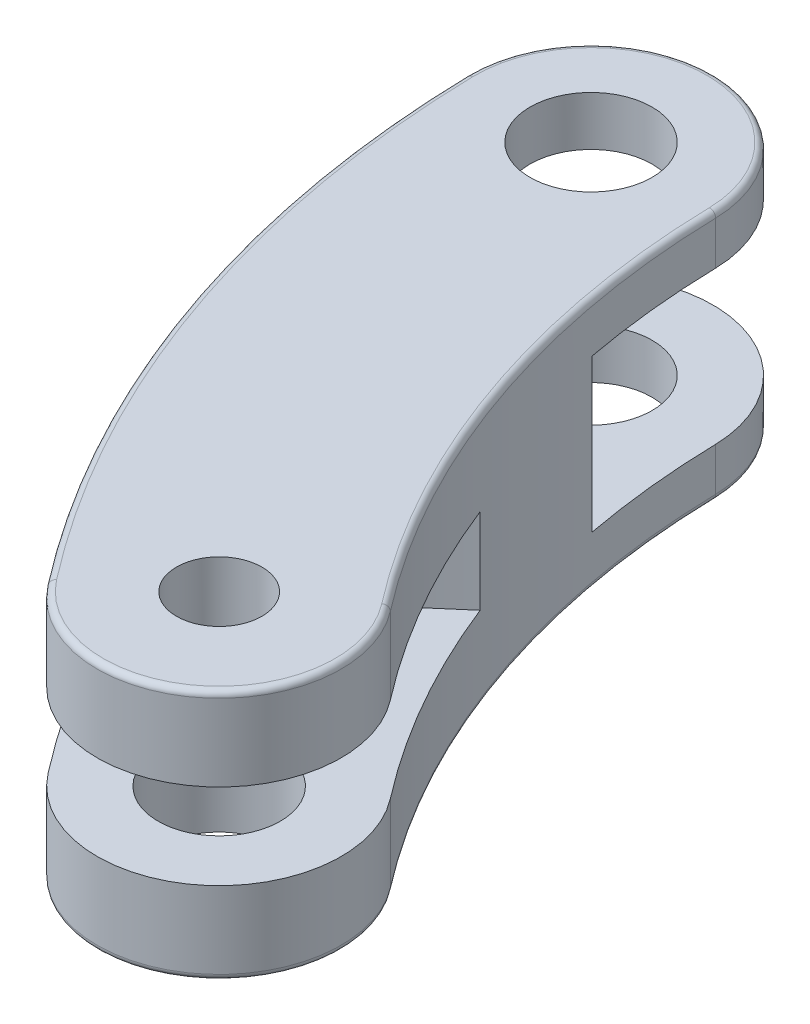
ISO-10303-21;
HEADER;
FILE_DESCRIPTION(('STEP AP214'),'2;1');
FILE_NAME('part.step','',(''),(''),'','','');
FILE_SCHEMA(('AUTOMOTIVE_DESIGN { 1 0 10303 214 1 1 1 1 }'));
ENDSEC;
DATA;
#1=APPLICATION_CONTEXT('core data for automotive mechanical design processes');
#2=APPLICATION_PROTOCOL_DEFINITION('international standard','automotive_design',2000,#1);
#3=PRODUCT_CONTEXT('',#1,'mechanical');
#4=PRODUCT('Part','Part','',(#3));
#5=PRODUCT_RELATED_PRODUCT_CATEGORY('part','',(#4));
#6=PRODUCT_DEFINITION_FORMATION('','',#4);
#7=PRODUCT_DEFINITION_CONTEXT('part definition',#1,'design');
#8=PRODUCT_DEFINITION('design','',#6,#7);
#9=PRODUCT_DEFINITION_SHAPE('','',#8);
#10=(LENGTH_UNIT() NAMED_UNIT(*) SI_UNIT(.MILLI.,.METRE.));
#11=(NAMED_UNIT(*) PLANE_ANGLE_UNIT() SI_UNIT($,.RADIAN.));
#12=(NAMED_UNIT(*) SI_UNIT($,.STERADIAN.) SOLID_ANGLE_UNIT());
#13=UNCERTAINTY_MEASURE_WITH_UNIT(LENGTH_MEASURE(1.E-05),#10,'distance_accuracy_value','');
#14=(GEOMETRIC_REPRESENTATION_CONTEXT(3) GLOBAL_UNCERTAINTY_ASSIGNED_CONTEXT((#13)) GLOBAL_UNIT_ASSIGNED_CONTEXT((#10,
#11,#12)) REPRESENTATION_CONTEXT('',''));
#15=CARTESIAN_POINT('',(0.,0.,0.));
#16=DIRECTION('',(0.,0.,1.));
#17=DIRECTION('',(1.,0.,0.));
#18=AXIS2_PLACEMENT_3D('',#15,#16,#17);
#19=CARTESIAN_POINT('',(2160.44964708,591.734442777,716.131939032001));
#20=DIRECTION('',(0.,1.,0.));
#21=DIRECTION('',(0.,0.,1.));
#22=AXIS2_PLACEMENT_3D('',#19,#20,#21);
#23=CYLINDRICAL_SURFACE('',#22,10.0000000013895);
#24=DIRECTION('',(0.,1.,0.));
#25=VECTOR('',#24,1.);
#26=CARTESIAN_POINT('',(2168.36413867013,591.734442777,710.019589001315));
#27=LINE('',#26,#25);
#28=CARTESIAN_POINT('',(2168.36413867013,605.534442777001,710.019589001315));
#29=VERTEX_POINT('',#28);
#30=CARTESIAN_POINT('',(2168.36413867013,611.833591467126,710.019589001315));
#31=VERTEX_POINT('',#30);
#32=EDGE_CURVE('E196',#29,#31,#27,.T.);
#33=ORIENTED_EDGE('',*,*,#32,.T.);
#34=CARTESIAN_POINT('',(2160.44964708,611.833591467126,716.131939032001));
#35=DIRECTION('',(0.,-1.,0.));
#36=DIRECTION('',(0.,0.,-1.));
#37=AXIS2_PLACEMENT_3D('',#34,#35,#36);
#38=CIRCLE('',#37,10.0000000013895);
#39=CARTESIAN_POINT('',(2152.535155487,611.833591467126,722.244289064911));
#40=VERTEX_POINT('',#39);
#41=EDGE_CURVE('E232',#31,#40,#38,.T.);
#42=ORIENTED_EDGE('',*,*,#41,.T.);
#43=DIRECTION('',(0.,1.,0.));
#44=VECTOR('',#43,1.);
#45=CARTESIAN_POINT('',(2152.535155487,591.734442777,722.244289064911));
#46=LINE('',#45,#44);
#47=CARTESIAN_POINT('',(2152.535155487,605.534442777001,722.244289064911));
#48=VERTEX_POINT('',#47);
#49=EDGE_CURVE('E199',#48,#40,#46,.T.);
#50=ORIENTED_EDGE('',*,*,#49,.F.);
#51=CARTESIAN_POINT('',(2160.44964708,605.534442777001,716.131939032001));
#52=DIRECTION('',(0.,1.,0.));
#53=DIRECTION('',(0.,0.,1.));
#54=AXIS2_PLACEMENT_3D('',#51,#52,#53);
#55=CIRCLE('',#54,10.0000000013895);
#56=EDGE_CURVE('E155',#29,#48,#55,.F.);
#57=ORIENTED_EDGE('',*,*,#56,.F.);
#58=EDGE_LOOP('',(#33,#42,#50,#57));
#59=FACE_BOUND('',#58,.T.);
#60=ADVANCED_FACE('F33',(#59),#23,.T.);
#61=CARTESIAN_POINT('',(2143.78489095,591.734442777,668.990811517002));
#62=DIRECTION('',(0.,1.,0.));
#63=DIRECTION('',(0.,0.,1.));
#64=AXIS2_PLACEMENT_3D('',#61,#62,#63);
#65=CYLINDRICAL_SURFACE('',#64,10.0000000022474);
#66=DIRECTION('',(0.,1.,0.));
#67=VECTOR('',#66,1.);
#68=CARTESIAN_POINT('',(2133.78730484331,591.734442777,669.210520607289));
#69=LINE('',#68,#67);
#70=CARTESIAN_POINT('',(2133.78730484331,608.284442777,669.210520607289));
#71=VERTEX_POINT('',#70);
#72=CARTESIAN_POINT('',(2133.78730484331,611.833591467126,669.210520607289));
#73=VERTEX_POINT('',#72);
#74=EDGE_CURVE('E202',#71,#73,#69,.T.);
#75=ORIENTED_EDGE('',*,*,#74,.T.);
#76=CARTESIAN_POINT('',(2143.78489095,611.833591467126,668.990811517002));
#77=DIRECTION('',(0.,-1.,0.));
#78=DIRECTION('',(0.,0.,-1.));
#79=AXIS2_PLACEMENT_3D('',#76,#77,#78);
#80=CIRCLE('',#79,10.0000000022474);
#81=CARTESIAN_POINT('',(2153.78247705669,611.833591467126,668.771102426715));
#82=VERTEX_POINT('',#81);
#83=EDGE_CURVE('E225',#73,#82,#80,.T.);
#84=ORIENTED_EDGE('',*,*,#83,.T.);
#85=DIRECTION('',(0.,1.,0.));
#86=VECTOR('',#85,1.);
#87=CARTESIAN_POINT('',(2153.78247705669,591.734442777,668.771102426715));
#88=LINE('',#87,#86);
#89=CARTESIAN_POINT('',(2153.78247705669,608.284442777,668.771102426715));
#90=VERTEX_POINT('',#89);
#91=EDGE_CURVE('E192',#90,#82,#88,.T.);
#92=ORIENTED_EDGE('',*,*,#91,.F.);
#93=CARTESIAN_POINT('',(2143.78489095,608.284442777,668.990811517002));
#94=DIRECTION('',(0.,1.,0.));
#95=DIRECTION('',(0.,0.,1.));
#96=AXIS2_PLACEMENT_3D('',#93,#94,#95);
#97=CIRCLE('',#96,10.0000000022474);
#98=EDGE_CURVE('E207',#71,#90,#97,.F.);
#99=ORIENTED_EDGE('',*,*,#98,.F.);
#100=EDGE_LOOP('',(#75,#84,#92,#99));
#101=FACE_BOUND('',#100,.T.);
#102=ADVANCED_FACE('F346',(#101),#65,.T.);
#103=CARTESIAN_POINT('',(2223.76557979,591.734442777,667.233138795002));
#104=DIRECTION('',(0.,1.,0.));
#105=DIRECTION('',(0.,0.,1.));
#106=AXIS2_PLACEMENT_3D('',#103,#104,#105);
#107=CYLINDRICAL_SURFACE('',#106,69.9999999986104);
#108=CARTESIAN_POINT('',(2168.36413867013,592.235398447253,710.019589001315));
#109=VERTEX_POINT('',#108);
#110=CARTESIAN_POINT('',(2168.36413867013,598.534442777,710.019589001315));
#111=VERTEX_POINT('',#110);
#112=EDGE_CURVE('E193',#109,#111,#27,.T.);
#113=ORIENTED_EDGE('',*,*,#112,.F.);
#114=CARTESIAN_POINT('',(2223.76557979,592.235398447253,667.233138795002));
#115=DIRECTION('',(0.,-1.,0.));
#116=DIRECTION('',(0.,0.,-1.));
#117=AXIS2_PLACEMENT_3D('',#114,#115,#116);
#118=CIRCLE('',#117,69.9999999986104);
#119=CARTESIAN_POINT('',(2153.78247705669,592.235398447253,668.771102426715));
#120=VERTEX_POINT('',#119);
#121=EDGE_CURVE('E234',#109,#120,#118,.T.);
#122=ORIENTED_EDGE('',*,*,#121,.T.);
#123=CARTESIAN_POINT('',(2153.78247705669,595.784442777,668.771102426715));
#124=VERTEX_POINT('',#123);
#125=EDGE_CURVE('E203',#120,#124,#88,.T.);
#126=ORIENTED_EDGE('',*,*,#125,.T.);
#127=CARTESIAN_POINT('',(2223.76557979,595.784442777,667.233138795002));
#128=DIRECTION('',(0.,-1.,0.));
#129=DIRECTION('',(0.,0.,-1.));
#130=AXIS2_PLACEMENT_3D('',#127,#128,#129);
#131=CIRCLE('',#130,69.9999999986104);
#132=CARTESIAN_POINT('',(2154.95172259144,595.784442777,680.064859539381));
#133=VERTEX_POINT('',#132);
#134=EDGE_CURVE('E183',#133,#124,#131,.T.);
#135=ORIENTED_EDGE('',*,*,#134,.F.);
#136=DIRECTION('',(0.,1.,0.));
#137=VECTOR('',#136,1.);
#138=CARTESIAN_POINT('',(2154.95172259144,602.034442777,680.064859539381));
#139=LINE('',#138,#137);
#140=CARTESIAN_POINT('',(2154.95172259144,608.284442777,680.064859539381));
#141=VERTEX_POINT('',#140);
#142=EDGE_CURVE('E190',#141,#133,#139,.F.);
#143=ORIENTED_EDGE('',*,*,#142,.F.);
#144=CARTESIAN_POINT('',(2223.76557979,608.284442777,667.233138795002));
#145=DIRECTION('',(0.,1.,0.));
#146=DIRECTION('',(0.,0.,1.));
#147=AXIS2_PLACEMENT_3D('',#144,#145,#146);
#148=CIRCLE('',#147,69.9999999986104);
#149=EDGE_CURVE('E188',#90,#141,#148,.T.);
#150=ORIENTED_EDGE('',*,*,#149,.F.);
#151=ORIENTED_EDGE('',*,*,#91,.T.);
#152=CARTESIAN_POINT('',(2223.76557979,611.833591467126,667.233138795002));
#153=DIRECTION('',(0.,-1.,0.));
#154=DIRECTION('',(0.,0.,-1.));
#155=AXIS2_PLACEMENT_3D('',#152,#153,#154);
#156=CIRCLE('',#155,69.9999999986104);
#157=EDGE_CURVE('E230',#82,#31,#156,.F.);
#158=ORIENTED_EDGE('',*,*,#157,.T.);
#159=ORIENTED_EDGE('',*,*,#32,.F.);
#160=CARTESIAN_POINT('',(2223.76557979,605.534442777001,667.233138795002));
#161=DIRECTION('',(0.,1.,0.));
#162=DIRECTION('',(0.,0.,1.));
#163=AXIS2_PLACEMENT_3D('',#160,#161,#162);
#164=CIRCLE('',#163,69.9999999986104);
#165=CARTESIAN_POINT('',(2158.66503431145,605.534442777001,692.960924906513));
#166=VERTEX_POINT('',#165);
#167=EDGE_CURVE('E170',#166,#29,#164,.T.);
#168=ORIENTED_EDGE('',*,*,#167,.F.);
#169=DIRECTION('',(0.,1.,0.));
#170=VECTOR('',#169,1.);
#171=CARTESIAN_POINT('',(2158.66503431145,602.034442777001,692.960924906513));
#172=LINE('',#171,#170);
#173=CARTESIAN_POINT('',(2158.66503431145,598.534442777,692.960924906513));
#174=VERTEX_POINT('',#173);
#175=EDGE_CURVE('E160',#174,#166,#172,.T.);
#176=ORIENTED_EDGE('',*,*,#175,.F.);
#177=CARTESIAN_POINT('',(2223.76557979,598.534442777,667.233138795002));
#178=DIRECTION('',(0.,-1.,0.));
#179=DIRECTION('',(0.,0.,-1.));
#180=AXIS2_PLACEMENT_3D('',#177,#178,#179);
#181=CIRCLE('',#180,69.9999999986104);
#182=EDGE_CURVE('E144',#111,#174,#181,.T.);
#183=ORIENTED_EDGE('',*,*,#182,.F.);
#184=EDGE_LOOP('',(#113,#122,#126,#135,#143,#150,#151,#158,#159,#168,#176,#183));
#185=FACE_BOUND('',#184,.T.);
#186=ADVANCED_FACE('F35',(#185),#107,.F.);
#187=CARTESIAN_POINT('',(2152.535155487,592.235398447253,722.244289064911));
#188=VERTEX_POINT('',#187);
#189=CARTESIAN_POINT('',(2152.535155487,598.534442777,722.244289064911));
#190=VERTEX_POINT('',#189);
#191=EDGE_CURVE('E197',#188,#190,#46,.T.);
#192=ORIENTED_EDGE('',*,*,#191,.F.);
#193=CARTESIAN_POINT('',(2160.44964708,592.235398447253,716.131939032001));
#194=DIRECTION('',(0.,-1.,0.));
#195=DIRECTION('',(0.,0.,-1.));
#196=AXIS2_PLACEMENT_3D('',#193,#194,#195);
#197=CIRCLE('',#196,10.0000000013895);
#198=EDGE_CURVE('E246',#188,#109,#197,.F.);
#199=ORIENTED_EDGE('',*,*,#198,.T.);
#200=ORIENTED_EDGE('',*,*,#112,.T.);
#201=CARTESIAN_POINT('',(2160.44964708,598.534442777,716.131939032001));
#202=DIRECTION('',(0.,-1.,0.));
#203=DIRECTION('',(0.,0.,-1.));
#204=AXIS2_PLACEMENT_3D('',#201,#202,#203);
#205=CIRCLE('',#204,10.0000000013895);
#206=EDGE_CURVE('E151',#190,#111,#205,.F.);
#207=ORIENTED_EDGE('',*,*,#206,.F.);
#208=EDGE_LOOP('',(#192,#199,#200,#207));
#209=FACE_BOUND('',#208,.T.);
#210=ADVANCED_FACE('F249',(#209),#23,.T.);
#211=CARTESIAN_POINT('',(2223.76557979,591.734442777,667.233138795002));
#212=DIRECTION('',(0.,1.,0.));
#213=DIRECTION('',(0.,0.,1.));
#214=AXIS2_PLACEMENT_3D('',#211,#212,#213);
#215=CYLINDRICAL_SURFACE('',#214,90.0000000022474);
#216=CARTESIAN_POINT('',(2133.78730484331,592.235398447253,669.210520607289));
#217=VERTEX_POINT('',#216);
#218=CARTESIAN_POINT('',(2133.78730484331,595.784442777,669.210520607289));
#219=VERTEX_POINT('',#218);
#220=EDGE_CURVE('E200',#217,#219,#69,.T.);
#221=ORIENTED_EDGE('',*,*,#220,.F.);
#222=CARTESIAN_POINT('',(2223.76557979,592.235398447253,667.233138795002));
#223=DIRECTION('',(0.,-1.,0.));
#224=DIRECTION('',(0.,0.,-1.));
#225=AXIS2_PLACEMENT_3D('',#222,#223,#224);
#226=CIRCLE('',#225,90.0000000022474);
#227=EDGE_CURVE('E11',#217,#188,#226,.F.);
#228=ORIENTED_EDGE('',*,*,#227,.T.);
#229=ORIENTED_EDGE('',*,*,#191,.T.);
#230=CARTESIAN_POINT('',(2223.76557979,598.534442777,667.233138795002));
#231=DIRECTION('',(0.,-1.,0.));
#232=DIRECTION('',(0.,0.,-1.));
#233=AXIS2_PLACEMENT_3D('',#230,#231,#232);
#234=CIRCLE('',#233,90.0000000022474);
#235=CARTESIAN_POINT('',(2143.99607730454,598.534442777,708.90838892773));
#236=VERTEX_POINT('',#235);
#237=EDGE_CURVE('E211',#236,#190,#234,.F.);
#238=ORIENTED_EDGE('',*,*,#237,.F.);
#239=DIRECTION('',(0.,1.,0.));
#240=VECTOR('',#239,1.);
#241=CARTESIAN_POINT('',(2143.99607730454,602.034442777001,708.90838892773));
#242=LINE('',#241,#240);
#243=CARTESIAN_POINT('',(2143.99607730454,605.534442777001,708.908388927731));
#244=VERTEX_POINT('',#243);
#245=EDGE_CURVE('E163',#244,#236,#242,.F.);
#246=ORIENTED_EDGE('',*,*,#245,.F.);
#247=CARTESIAN_POINT('',(2223.76557979,605.534442777001,667.233138795002));
#248=DIRECTION('',(0.,1.,0.));
#249=DIRECTION('',(0.,0.,1.));
#250=AXIS2_PLACEMENT_3D('',#247,#248,#249);
#251=CIRCLE('',#250,90.0000000022474);
#252=EDGE_CURVE('E214',#48,#244,#251,.F.);
#253=ORIENTED_EDGE('',*,*,#252,.F.);
#254=ORIENTED_EDGE('',*,*,#49,.T.);
#255=CARTESIAN_POINT('',(2223.76557979,611.833591467126,667.233138795002));
#256=DIRECTION('',(0.,-1.,0.));
#257=DIRECTION('',(0.,0.,-1.));
#258=AXIS2_PLACEMENT_3D('',#255,#256,#257);
#259=CIRCLE('',#258,90.0000000022474);
#260=EDGE_CURVE('E228',#40,#73,#259,.T.);
#261=ORIENTED_EDGE('',*,*,#260,.T.);
#262=ORIENTED_EDGE('',*,*,#74,.F.);
#263=CARTESIAN_POINT('',(2223.76557979,608.284442777,667.233138795002));
#264=DIRECTION('',(0.,1.,0.));
#265=DIRECTION('',(0.,0.,1.));
#266=AXIS2_PLACEMENT_3D('',#263,#264,#265);
#267=CIRCLE('',#266,90.0000000022474);
#268=CARTESIAN_POINT('',(2135.40094688099,608.284442777,684.31212152993));
#269=VERTEX_POINT('',#268);
#270=EDGE_CURVE('E186',#269,#71,#267,.F.);
#271=ORIENTED_EDGE('',*,*,#270,.F.);
#272=DIRECTION('',(0.,1.,0.));
#273=VECTOR('',#272,1.);
#274=CARTESIAN_POINT('',(2135.40094688099,602.034442777,684.31212152993));
#275=LINE('',#274,#273);
#276=CARTESIAN_POINT('',(2135.40094688099,595.784442777,684.31212152993));
#277=VERTEX_POINT('',#276);
#278=EDGE_CURVE('E209',#277,#269,#275,.T.);
#279=ORIENTED_EDGE('',*,*,#278,.F.);
#280=CARTESIAN_POINT('',(2223.76557979,595.784442777,667.233138795002));
#281=DIRECTION('',(0.,-1.,0.));
#282=DIRECTION('',(0.,0.,-1.));
#283=AXIS2_PLACEMENT_3D('',#280,#281,#282);
#284=CIRCLE('',#283,90.0000000022474);
#285=EDGE_CURVE('E181',#219,#277,#284,.F.);
#286=ORIENTED_EDGE('',*,*,#285,.F.);
#287=EDGE_LOOP('',(#221,#228,#229,#238,#246,#253,#254,#261,#262,#271,#279,#286));
#288=FACE_BOUND('',#287,.T.);
#289=ADVANCED_FACE('F319',(#288),#215,.T.);
#290=ORIENTED_EDGE('',*,*,#125,.F.);
#291=CARTESIAN_POINT('',(2143.78489095,592.235398447253,668.990811517002));
#292=DIRECTION('',(0.,-1.,0.));
#293=DIRECTION('',(0.,0.,-1.));
#294=AXIS2_PLACEMENT_3D('',#291,#292,#293);
#295=CIRCLE('',#294,10.0000000022474);
#296=EDGE_CURVE('E41',#120,#217,#295,.F.);
#297=ORIENTED_EDGE('',*,*,#296,.T.);
#298=ORIENTED_EDGE('',*,*,#220,.T.);
#299=CARTESIAN_POINT('',(2143.78489095,595.784442777,668.990811517002));
#300=DIRECTION('',(0.,-1.,0.));
#301=DIRECTION('',(0.,0.,-1.));
#302=AXIS2_PLACEMENT_3D('',#299,#300,#301);
#303=CIRCLE('',#302,10.0000000022474);
#304=EDGE_CURVE('E195',#124,#219,#303,.F.);
#305=ORIENTED_EDGE('',*,*,#304,.F.);
#306=EDGE_LOOP('',(#290,#297,#298,#305));
#307=FACE_BOUND('',#306,.T.);
#308=ADVANCED_FACE('F365',(#307),#65,.T.);
#309=CARTESIAN_POINT('',(2183.77523537,591.734442777,668.111975156002));
#310=DIRECTION('',(0.,-1.,0.));
#311=DIRECTION('',(0.,0.,-1.));
#312=AXIS2_PLACEMENT_3D('',#309,#310,#311);
#313=PLANE('',#312);
#314=CARTESIAN_POINT('',(2143.78489095,591.734442777,668.990811517002));
#315=DIRECTION('',(0.,-1.,0.));
#316=DIRECTION('',(0.,0.,-1.));
#317=AXIS2_PLACEMENT_3D('',#314,#315,#316);
#318=CIRCLE('',#317,9.49904433199418);
#319=CARTESIAN_POINT('',(2134.28813959259,591.734442777,669.199514155734));
#320=VERTEX_POINT('',#319);
#321=CARTESIAN_POINT('',(2153.2816423119,591.734442777,668.782108878171));
#322=VERTEX_POINT('',#321);
#323=EDGE_CURVE('E239',#320,#322,#318,.T.);
#324=ORIENTED_EDGE('',*,*,#323,.T.);
#325=CARTESIAN_POINT('',(2223.76557979,591.734442777,667.233138795002));
#326=DIRECTION('',(0.,-1.,0.));
#327=DIRECTION('',(0.,0.,-1.));
#328=AXIS2_PLACEMENT_3D('',#325,#326,#327);
#329=CIRCLE('',#328,70.5009556688637);
#330=CARTESIAN_POINT('',(2167.96765772626,591.734442777,710.325790641917));
#331=VERTEX_POINT('',#330);
#332=EDGE_CURVE('E243',#322,#331,#329,.F.);
#333=ORIENTED_EDGE('',*,*,#332,.T.);
#334=CARTESIAN_POINT('',(2160.44964708,591.734442777,716.131939032001));
#335=DIRECTION('',(0.,-1.,0.));
#336=DIRECTION('',(0.,0.,-1.));
#337=AXIS2_PLACEMENT_3D('',#334,#335,#336);
#338=CIRCLE('',#337,9.49904433113628);
#339=CARTESIAN_POINT('',(2152.93163643087,591.734442777,721.938087424309));
#340=VERTEX_POINT('',#339);
#341=EDGE_CURVE('E241',#331,#340,#338,.T.);
#342=ORIENTED_EDGE('',*,*,#341,.T.);
#343=CARTESIAN_POINT('',(2223.76557979,591.734442777,667.233138795002));
#344=DIRECTION('',(0.,-1.,0.));
#345=DIRECTION('',(0.,0.,-1.));
#346=AXIS2_PLACEMENT_3D('',#343,#344,#345);
#347=CIRCLE('',#346,89.4990443319942);
#348=EDGE_CURVE('E237',#340,#320,#347,.T.);
#349=ORIENTED_EDGE('',*,*,#348,.T.);
#350=EDGE_LOOP('',(#324,#333,#342,#349));
#351=FACE_BOUND('',#350,.T.);
#352=CARTESIAN_POINT('',(2143.78489095,591.734442777,668.990811517002));
#353=DIRECTION('',(0.,-1.,0.));
#354=DIRECTION('',(0.,0.,1.));
#355=AXIS2_PLACEMENT_3D('',#352,#353,#354);
#356=CIRCLE('',#355,5.);
#357=CARTESIAN_POINT('',(2143.78489095,591.734442777,673.990811517002));
#358=VERTEX_POINT('',#357);
#359=EDGE_CURVE('E287',#358,#358,#356,.T.);
#360=ORIENTED_EDGE('',*,*,#359,.F.);
#361=EDGE_LOOP('',(#360));
#362=FACE_BOUND('',#361,.T.);
#363=CARTESIAN_POINT('',(2160.44964708,591.734442777,716.131939032002));
#364=DIRECTION('',(0.,-1.,0.));
#365=DIRECTION('',(0.,0.,1.));
#366=AXIS2_PLACEMENT_3D('',#363,#364,#365);
#367=CIRCLE('',#366,5.);
#368=CARTESIAN_POINT('',(2160.44964708,591.734442777,721.131939032002));
#369=VERTEX_POINT('',#368);
#370=EDGE_CURVE('E293',#369,#369,#367,.T.);
#371=ORIENTED_EDGE('',*,*,#370,.F.);
#372=EDGE_LOOP('',(#371));
#373=FACE_BOUND('',#372,.T.);
#374=ADVANCED_FACE('F540',(#351,#362,#373),#313,.T.);
#375=CARTESIAN_POINT('',(2183.77523537,612.334442777,668.111975156002));
#376=DIRECTION('',(0.,-1.,0.));
#377=DIRECTION('',(0.,0.,-1.));
#378=AXIS2_PLACEMENT_3D('',#375,#376,#377);
#379=PLANE('',#378);
#380=CARTESIAN_POINT('',(2223.76557979,612.334442777,667.233138795002));
#381=DIRECTION('',(0.,-1.,0.));
#382=DIRECTION('',(0.,0.,-1.));
#383=AXIS2_PLACEMENT_3D('',#380,#381,#382);
#384=CIRCLE('',#383,70.5008513084845);
#385=CARTESIAN_POINT('',(2167.96774032219,612.334442777,710.3257268532));
#386=VERTEX_POINT('',#385);
#387=CARTESIAN_POINT('',(2153.28174665072,612.334442777,668.782106585199));
#388=VERTEX_POINT('',#387);
#389=EDGE_CURVE('E218',#386,#388,#384,.T.);
#390=ORIENTED_EDGE('',*,*,#389,.T.);
#391=CARTESIAN_POINT('',(2143.78489095,612.334442777,668.990811517002));
#392=DIRECTION('',(0.,-1.,0.));
#393=DIRECTION('',(0.,0.,-1.));
#394=AXIS2_PLACEMENT_3D('',#391,#392,#393);
#395=CIRCLE('',#394,9.49914869237342);
#396=CARTESIAN_POINT('',(2134.28803525741,612.334442777,669.199516448627));
#397=VERTEX_POINT('',#396);
#398=EDGE_CURVE('E222',#388,#397,#395,.F.);
#399=ORIENTED_EDGE('',*,*,#398,.T.);
#400=CARTESIAN_POINT('',(2223.76557979,612.334442777,667.233138795002));
#401=DIRECTION('',(0.,-1.,0.));
#402=DIRECTION('',(0.,0.,-1.));
#403=AXIS2_PLACEMENT_3D('',#400,#401,#402);
#404=CIRCLE('',#403,89.4991486923734);
#405=CARTESIAN_POINT('',(2152.93155383781,612.334442777,721.938151210803));
#406=VERTEX_POINT('',#405);
#407=EDGE_CURVE('E220',#397,#406,#404,.F.);
#408=ORIENTED_EDGE('',*,*,#407,.T.);
#409=CARTESIAN_POINT('',(2160.44964708,612.334442777,716.131939032001));
#410=DIRECTION('',(0.,-1.,0.));
#411=DIRECTION('',(0.,0.,-1.));
#412=AXIS2_PLACEMENT_3D('',#409,#410,#411);
#413=CIRCLE('',#412,9.49914869151552);
#414=EDGE_CURVE('E216',#406,#386,#413,.F.);
#415=ORIENTED_EDGE('',*,*,#414,.T.);
#416=EDGE_LOOP('',(#390,#399,#408,#415));
#417=FACE_BOUND('',#416,.T.);
#418=CARTESIAN_POINT('',(2143.78489095,612.334442777,668.990811517002));
#419=DIRECTION('',(0.,-1.,0.));
#420=DIRECTION('',(0.,0.,-1.));
#421=AXIS2_PLACEMENT_3D('',#418,#419,#420);
#422=CIRCLE('',#421,5.);
#423=CARTESIAN_POINT('',(2143.78489095,612.334442777,663.990811517002));
#424=VERTEX_POINT('',#423);
#425=EDGE_CURVE('E302',#424,#424,#422,.F.);
#426=ORIENTED_EDGE('',*,*,#425,.F.);
#427=EDGE_LOOP('',(#426));
#428=FACE_BOUND('',#427,.T.);
#429=CARTESIAN_POINT('',(2160.44964708,612.334442777,716.131939032));
#430=DIRECTION('',(0.,1.,0.));
#431=DIRECTION('',(0.,0.,-1.));
#432=AXIS2_PLACEMENT_3D('',#429,#430,#431);
#433=CIRCLE('',#432,3.49999999999995);
#434=CARTESIAN_POINT('',(2160.44964708,612.334442777,712.631939032));
#435=VERTEX_POINT('',#434);
#436=EDGE_CURVE('E305',#435,#435,#433,.T.);
#437=ORIENTED_EDGE('',*,*,#436,.F.);
#438=EDGE_LOOP('',(#437));
#439=FACE_BOUND('',#438,.T.);
#440=ADVANCED_FACE('F334',(#417,#428,#439),#379,.F.);
#441=CARTESIAN_POINT('',(2128.32635665,595.784442777,604.625546920002));
#442=DIRECTION('',(0.,1.,0.));
#443=DIRECTION('',(0.,0.,1.));
#444=AXIS2_PLACEMENT_3D('',#441,#442,#443);
#445=CYLINDRICAL_SURFACE('',#444,80.0000000000001);
#446=ORIENTED_EDGE('',*,*,#142,.T.);
#447=CARTESIAN_POINT('',(2128.32635665,595.784442777,604.625546920002));
#448=DIRECTION('',(0.,1.,0.));
#449=DIRECTION('',(0.,0.,1.));
#450=AXIS2_PLACEMENT_3D('',#447,#448,#449);
#451=CIRCLE('',#450,80.);
#452=EDGE_CURVE('E171',#277,#133,#451,.T.);
#453=ORIENTED_EDGE('',*,*,#452,.F.);
#454=ORIENTED_EDGE('',*,*,#278,.T.);
#455=CARTESIAN_POINT('',(2128.32635665,608.284442777,604.625546920002));
#456=DIRECTION('',(0.,1.,0.));
#457=DIRECTION('',(0.,0.,1.));
#458=AXIS2_PLACEMENT_3D('',#455,#456,#457);
#459=CIRCLE('',#458,80.0000000000002);
#460=EDGE_CURVE('E174',#269,#141,#459,.T.);
#461=ORIENTED_EDGE('',*,*,#460,.T.);
#462=EDGE_LOOP('',(#446,#453,#454,#461));
#463=FACE_BOUND('',#462,.T.);
#464=ADVANCED_FACE('F527',(#463),#445,.F.);
#465=CARTESIAN_POINT('',(2128.32635665,608.284442777,604.625546920002));
#466=DIRECTION('',(0.,1.,0.));
#467=DIRECTION('',(0.,0.,1.));
#468=AXIS2_PLACEMENT_3D('',#465,#466,#467);
#469=PLANE('',#468);
#470=CARTESIAN_POINT('',(2143.78489095,608.284442777,668.990811517002));
#471=DIRECTION('',(0.,-1.,0.));
#472=DIRECTION('',(0.,0.,1.));
#473=AXIS2_PLACEMENT_3D('',#470,#471,#472);
#474=CIRCLE('',#473,5.);
#475=CARTESIAN_POINT('',(2143.78489095,608.284442777,673.990811517002));
#476=VERTEX_POINT('',#475);
#477=EDGE_CURVE('E299',#476,#476,#474,.T.);
#478=ORIENTED_EDGE('',*,*,#477,.F.);
#479=EDGE_LOOP('',(#478));
#480=FACE_BOUND('',#479,.T.);
#481=ORIENTED_EDGE('',*,*,#149,.T.);
#482=ORIENTED_EDGE('',*,*,#460,.F.);
#483=ORIENTED_EDGE('',*,*,#270,.T.);
#484=ORIENTED_EDGE('',*,*,#98,.T.);
#485=EDGE_LOOP('',(#481,#482,#483,#484));
#486=FACE_BOUND('',#485,.T.);
#487=ADVANCED_FACE('F520',(#480,#486),#469,.F.);
#488=CARTESIAN_POINT('',(2154.95172259093,595.784442777,680.064859539562));
#489=DIRECTION('',(0.,-1.,0.));
#490=DIRECTION('',(0.,0.,-1.));
#491=AXIS2_PLACEMENT_3D('',#488,#489,#490);
#492=PLANE('',#491);
#493=CARTESIAN_POINT('',(2143.78489095,595.784442777,668.990811517002));
#494=DIRECTION('',(0.,-1.,0.));
#495=DIRECTION('',(0.,0.,-1.));
#496=AXIS2_PLACEMENT_3D('',#493,#494,#495);
#497=CIRCLE('',#496,5.);
#498=CARTESIAN_POINT('',(2143.78489095,595.784442777,663.990811517002));
#499=VERTEX_POINT('',#498);
#500=EDGE_CURVE('E290',#499,#499,#497,.F.);
#501=ORIENTED_EDGE('',*,*,#500,.F.);
#502=EDGE_LOOP('',(#501));
#503=FACE_BOUND('',#502,.T.);
#504=ORIENTED_EDGE('',*,*,#134,.T.);
#505=ORIENTED_EDGE('',*,*,#304,.T.);
#506=ORIENTED_EDGE('',*,*,#285,.T.);
#507=ORIENTED_EDGE('',*,*,#452,.T.);
#508=EDGE_LOOP('',(#504,#505,#506,#507));
#509=FACE_BOUND('',#508,.T.);
#510=ADVANCED_FACE('F391',(#503,#509),#492,.F.);
#511=CARTESIAN_POINT('',(2209.66760327,598.534442777,754.594827587));
#512=DIRECTION('',(0.,1.,0.));
#513=DIRECTION('',(0.,0.,1.));
#514=AXIS2_PLACEMENT_3D('',#511,#512,#513);
#515=CYLINDRICAL_SURFACE('',#514,79.9999999999997);
#516=ORIENTED_EDGE('',*,*,#175,.T.);
#517=CARTESIAN_POINT('',(2209.66760327,605.534442777001,754.594827587));
#518=DIRECTION('',(0.,1.,0.));
#519=DIRECTION('',(0.,0.,1.));
#520=AXIS2_PLACEMENT_3D('',#517,#518,#519);
#521=CIRCLE('',#520,79.9999999999996);
#522=EDGE_CURVE('E165',#166,#244,#521,.T.);
#523=ORIENTED_EDGE('',*,*,#522,.T.);
#524=ORIENTED_EDGE('',*,*,#245,.T.);
#525=CARTESIAN_POINT('',(2209.66760327,598.534442777,754.594827587));
#526=DIRECTION('',(0.,1.,0.));
#527=DIRECTION('',(0.,0.,1.));
#528=AXIS2_PLACEMENT_3D('',#525,#526,#527);
#529=CIRCLE('',#528,79.9999999999998);
#530=EDGE_CURVE('E148',#174,#236,#529,.T.);
#531=ORIENTED_EDGE('',*,*,#530,.F.);
#532=EDGE_LOOP('',(#516,#523,#524,#531));
#533=FACE_BOUND('',#532,.T.);
#534=ADVANCED_FACE('F158',(#533),#515,.F.);
#535=CARTESIAN_POINT('',(2209.66760327,605.534442777001,754.594827587));
#536=DIRECTION('',(0.,1.,0.));
#537=DIRECTION('',(0.,0.,1.));
#538=AXIS2_PLACEMENT_3D('',#535,#536,#537);
#539=PLANE('',#538);
#540=CARTESIAN_POINT('',(2160.44964708,605.534442777001,716.131939032));
#541=DIRECTION('',(0.,1.,0.));
#542=DIRECTION('',(0.,0.,1.));
#543=AXIS2_PLACEMENT_3D('',#540,#541,#542);
#544=CIRCLE('',#543,3.49999999999995);
#545=CARTESIAN_POINT('',(2160.44964708,605.534442777001,719.631939032));
#546=VERTEX_POINT('',#545);
#547=EDGE_CURVE('E166',#546,#546,#544,.F.);
#548=ORIENTED_EDGE('',*,*,#547,.F.);
#549=EDGE_LOOP('',(#548));
#550=FACE_BOUND('',#549,.T.);
#551=ORIENTED_EDGE('',*,*,#167,.T.);
#552=ORIENTED_EDGE('',*,*,#56,.T.);
#553=ORIENTED_EDGE('',*,*,#252,.T.);
#554=ORIENTED_EDGE('',*,*,#522,.F.);
#555=EDGE_LOOP('',(#551,#552,#553,#554));
#556=FACE_BOUND('',#555,.T.);
#557=ADVANCED_FACE('F314',(#550,#556),#539,.F.);
#558=CARTESIAN_POINT('',(2143.99607730598,598.534442777,708.90838892565));
#559=DIRECTION('',(0.,-1.,0.));
#560=DIRECTION('',(0.,0.,-1.));
#561=AXIS2_PLACEMENT_3D('',#558,#559,#560);
#562=PLANE('',#561);
#563=CARTESIAN_POINT('',(2160.44964708,598.534442777,716.131939032002));
#564=DIRECTION('',(0.,-1.,0.));
#565=DIRECTION('',(0.,0.,-1.));
#566=AXIS2_PLACEMENT_3D('',#563,#564,#565);
#567=CIRCLE('',#566,5.);
#568=CARTESIAN_POINT('',(2160.44964708,598.534442777,711.131939032002));
#569=VERTEX_POINT('',#568);
#570=EDGE_CURVE('E296',#569,#569,#567,.F.);
#571=ORIENTED_EDGE('',*,*,#570,.F.);
#572=EDGE_LOOP('',(#571));
#573=FACE_BOUND('',#572,.T.);
#574=ORIENTED_EDGE('',*,*,#182,.T.);
#575=ORIENTED_EDGE('',*,*,#530,.T.);
#576=ORIENTED_EDGE('',*,*,#237,.T.);
#577=ORIENTED_EDGE('',*,*,#206,.T.);
#578=EDGE_LOOP('',(#574,#575,#576,#577));
#579=FACE_BOUND('',#578,.T.);
#580=ADVANCED_FACE('F146',(#573,#579),#562,.F.);
#581=CARTESIAN_POINT('',(2160.44964708,591.733442777,716.131939032));
#582=DIRECTION('',(0.,1.,0.));
#583=DIRECTION('',(0.,0.,1.));
#584=AXIS2_PLACEMENT_3D('',#581,#582,#583);
#585=CYLINDRICAL_SURFACE('',#584,3.49999999999995);
#586=ORIENTED_EDGE('',*,*,#436,.T.);
#587=EDGE_LOOP('',(#586));
#588=FACE_BOUND('',#587,.T.);
#589=ORIENTED_EDGE('',*,*,#547,.T.);
#590=EDGE_LOOP('',(#589));
#591=FACE_BOUND('',#590,.T.);
#592=ADVANCED_FACE('F416',(#588,#591),#585,.F.);
#593=CARTESIAN_POINT('',(2143.78489095,612.335442777,668.990811517002));
#594=DIRECTION('',(0.,-1.,0.));
#595=DIRECTION('',(0.,0.,-1.));
#596=AXIS2_PLACEMENT_3D('',#593,#594,#595);
#597=CYLINDRICAL_SURFACE('',#596,5.);
#598=ORIENTED_EDGE('',*,*,#477,.T.);
#599=EDGE_LOOP('',(#598));
#600=FACE_BOUND('',#599,.T.);
#601=ORIENTED_EDGE('',*,*,#425,.T.);
#602=EDGE_LOOP('',(#601));
#603=FACE_BOUND('',#602,.T.);
#604=ADVANCED_FACE('F425',(#600,#603),#597,.F.);
#605=CARTESIAN_POINT('',(2160.44964708,612.335442777,716.131939032002));
#606=DIRECTION('',(0.,-1.,0.));
#607=DIRECTION('',(0.,0.,-1.));
#608=AXIS2_PLACEMENT_3D('',#605,#606,#607);
#609=CYLINDRICAL_SURFACE('',#608,5.);
#610=ORIENTED_EDGE('',*,*,#370,.T.);
#611=EDGE_LOOP('',(#610));
#612=FACE_BOUND('',#611,.T.);
#613=ORIENTED_EDGE('',*,*,#570,.T.);
#614=EDGE_LOOP('',(#613));
#615=FACE_BOUND('',#614,.T.);
#616=ADVANCED_FACE('F434',(#612,#615),#609,.F.);
#617=CARTESIAN_POINT('',(2143.78489095,612.335442777,668.990811517002));
#618=DIRECTION('',(0.,-1.,0.));
#619=DIRECTION('',(0.,0.,-1.));
#620=AXIS2_PLACEMENT_3D('',#617,#618,#619);
#621=CYLINDRICAL_SURFACE('',#620,5.);
#622=ORIENTED_EDGE('',*,*,#359,.T.);
#623=EDGE_LOOP('',(#622));
#624=FACE_BOUND('',#623,.T.);
#625=ORIENTED_EDGE('',*,*,#500,.T.);
#626=EDGE_LOOP('',(#625));
#627=FACE_BOUND('',#626,.T.);
#628=ADVANCED_FACE('F443',(#624,#627),#621,.F.);
#629=CARTESIAN_POINT('',(2160.44964708,611.833591467126,716.131939032001));
#630=DIRECTION('',(0.,-1.,0.));
#631=DIRECTION('',(0.,0.,-1.));
#632=AXIS2_PLACEMENT_3D('',#629,#630,#631);
#633=TOROIDAL_SURFACE('',#632,9.49914869151552,0.500851309874023);
#634=CARTESIAN_POINT('',(2152.93155383781,611.833591467126,721.938151210803));
#635=DIRECTION('',(-0.611235002983835,0.,-0.791449158902422));
#636=DIRECTION('',(-0.791449158902422,0.,0.611235002983835));
#637=AXIS2_PLACEMENT_3D('',#634,#635,#636);
#638=CIRCLE('',#637,0.500851309874023);
#639=EDGE_CURVE('E281',#40,#406,#638,.T.);
#640=ORIENTED_EDGE('',*,*,#639,.F.);
#641=ORIENTED_EDGE('',*,*,#41,.F.);
#642=CARTESIAN_POINT('',(2167.96774032219,611.833591467126,710.3257268532));
#643=DIRECTION('',(-0.611235002983974,0.,-0.791449158902315));
#644=DIRECTION('',(-0.791449158902315,0.,0.611235002983974));
#645=AXIS2_PLACEMENT_3D('',#642,#643,#644);
#646=CIRCLE('',#645,0.500851309874023);
#647=EDGE_CURVE('E284',#386,#31,#646,.T.);
#648=ORIENTED_EDGE('',*,*,#647,.F.);
#649=ORIENTED_EDGE('',*,*,#414,.F.);
#650=EDGE_LOOP('',(#640,#641,#648,#649));
#651=FACE_BOUND('',#650,.T.);
#652=ADVANCED_FACE('F324',(#651),#633,.T.);
#653=CARTESIAN_POINT('',(2223.76557979,611.833591467126,667.233138795002));
#654=DIRECTION('',(0.,-1.,0.));
#655=DIRECTION('',(0.,0.,-1.));
#656=AXIS2_PLACEMENT_3D('',#653,#654,#655);
#657=TOROIDAL_SURFACE('',#656,70.5008513084845,0.500851309874023);
#658=ORIENTED_EDGE('',*,*,#647,.T.);
#659=ORIENTED_EDGE('',*,*,#157,.F.);
#660=CARTESIAN_POINT('',(2153.28174665072,611.833591467126,668.782106585199));
#661=DIRECTION('',(-0.0219709090238263,0.,-0.999758610443875));
#662=DIRECTION('',(-0.999758610443875,0.,0.0219709090238263));
#663=AXIS2_PLACEMENT_3D('',#660,#661,#662);
#664=CIRCLE('',#663,0.500851309874023);
#665=EDGE_CURVE('E279',#388,#82,#664,.T.);
#666=ORIENTED_EDGE('',*,*,#665,.F.);
#667=ORIENTED_EDGE('',*,*,#389,.F.);
#668=EDGE_LOOP('',(#658,#659,#666,#667));
#669=FACE_BOUND('',#668,.T.);
#670=ADVANCED_FACE('F330',(#669),#657,.T.);
#671=CARTESIAN_POINT('',(2223.76557979,611.833591467126,667.233138795002));
#672=DIRECTION('',(0.,-1.,0.));
#673=DIRECTION('',(0.,0.,-1.));
#674=AXIS2_PLACEMENT_3D('',#671,#672,#673);
#675=TOROIDAL_SURFACE('',#674,89.4991486923734,0.500851309874023);
#676=ORIENTED_EDGE('',*,*,#639,.T.);
#677=ORIENTED_EDGE('',*,*,#407,.F.);
#678=CARTESIAN_POINT('',(2134.28803525741,611.833591467126,669.199516448627));
#679=DIRECTION('',(-0.0219709090238068,0.,-0.999758610443875));
#680=DIRECTION('',(-0.999758610443875,0.,0.0219709090238068));
#681=AXIS2_PLACEMENT_3D('',#678,#679,#680);
#682=CIRCLE('',#681,0.500851309874023);
#683=EDGE_CURVE('E275',#73,#397,#682,.T.);
#684=ORIENTED_EDGE('',*,*,#683,.F.);
#685=ORIENTED_EDGE('',*,*,#260,.F.);
#686=EDGE_LOOP('',(#676,#677,#684,#685));
#687=FACE_BOUND('',#686,.T.);
#688=ADVANCED_FACE('F338',(#687),#675,.T.);
#689=CARTESIAN_POINT('',(2143.78489095,611.833591467126,668.990811517002));
#690=DIRECTION('',(0.,-1.,0.));
#691=DIRECTION('',(0.,0.,-1.));
#692=AXIS2_PLACEMENT_3D('',#689,#690,#691);
#693=TOROIDAL_SURFACE('',#692,9.49914869237342,0.500851309874023);
#694=ORIENTED_EDGE('',*,*,#665,.T.);
#695=ORIENTED_EDGE('',*,*,#83,.F.);
#696=ORIENTED_EDGE('',*,*,#683,.T.);
#697=ORIENTED_EDGE('',*,*,#398,.F.);
#698=EDGE_LOOP('',(#694,#695,#696,#697));
#699=FACE_BOUND('',#698,.T.);
#700=ADVANCED_FACE('F350',(#699),#693,.T.);
#701=CARTESIAN_POINT('',(2223.76557979,592.235398447253,667.233138795002));
#702=DIRECTION('',(0.,-1.,0.));
#703=DIRECTION('',(0.,0.,-1.));
#704=AXIS2_PLACEMENT_3D('',#701,#702,#703);
#705=TOROIDAL_SURFACE('',#704,89.4990443319942,0.500955670253265);
#706=CARTESIAN_POINT('',(2134.28813959259,592.235398447253,669.199514155734));
#707=DIRECTION('',(-0.0219709090238795,0.,-0.999758610443873));
#708=DIRECTION('',(-0.999758610443873,0.,0.0219709090238795));
#709=AXIS2_PLACEMENT_3D('',#706,#707,#708);
#710=CIRCLE('',#709,0.500955670253265);
#711=EDGE_CURVE('E260',#320,#217,#710,.T.);
#712=ORIENTED_EDGE('',*,*,#711,.F.);
#713=ORIENTED_EDGE('',*,*,#348,.F.);
#714=CARTESIAN_POINT('',(2152.93163643087,592.235398447253,721.938087424309));
#715=DIRECTION('',(0.611235002983723,1.7540176331164E-13,0.791449158902509));
#716=DIRECTION('',(0.791449158902509,0.,-0.611235002983723));
#717=AXIS2_PLACEMENT_3D('',#714,#715,#716);
#718=CIRCLE('',#717,0.500955670253265);
#719=EDGE_CURVE('E273',#188,#340,#718,.T.);
#720=ORIENTED_EDGE('',*,*,#719,.F.);
#721=ORIENTED_EDGE('',*,*,#227,.F.);
#722=EDGE_LOOP('',(#712,#713,#720,#721));
#723=FACE_BOUND('',#722,.T.);
#724=ADVANCED_FACE('F352',(#723),#705,.T.);
#725=CARTESIAN_POINT('',(2160.44964708,592.235398447253,716.131939032001));
#726=DIRECTION('',(0.,-1.,0.));
#727=DIRECTION('',(0.,0.,-1.));
#728=AXIS2_PLACEMENT_3D('',#725,#726,#727);
#729=TOROIDAL_SURFACE('',#728,9.49904433113628,0.500955670253265);
#730=ORIENTED_EDGE('',*,*,#719,.T.);
#731=ORIENTED_EDGE('',*,*,#341,.F.);
#732=CARTESIAN_POINT('',(2167.96765772626,592.235398447253,710.325790641917));
#733=DIRECTION('',(-0.611235002983584,0.,-0.791449158902616));
#734=DIRECTION('',(-0.791449158902616,0.,0.611235002983584));
#735=AXIS2_PLACEMENT_3D('',#732,#733,#734);
#736=CIRCLE('',#735,0.500955670253265);
#737=EDGE_CURVE('E256',#109,#331,#736,.T.);
#738=ORIENTED_EDGE('',*,*,#737,.F.);
#739=ORIENTED_EDGE('',*,*,#198,.F.);
#740=EDGE_LOOP('',(#730,#731,#738,#739));
#741=FACE_BOUND('',#740,.T.);
#742=ADVANCED_FACE('F257',(#741),#729,.T.);
#743=CARTESIAN_POINT('',(2143.78489095,592.235398447253,668.990811517002));
#744=DIRECTION('',(0.,-1.,0.));
#745=DIRECTION('',(0.,0.,-1.));
#746=AXIS2_PLACEMENT_3D('',#743,#744,#745);
#747=TOROIDAL_SURFACE('',#746,9.49904433199418,0.500955670253265);
#748=ORIENTED_EDGE('',*,*,#711,.T.);
#749=ORIENTED_EDGE('',*,*,#296,.F.);
#750=CARTESIAN_POINT('',(2153.2816423119,592.235398447253,668.782108878171));
#751=DIRECTION('',(0.021970909023658,0.,0.999758610443878));
#752=DIRECTION('',(0.999758610443878,0.,-0.021970909023658));
#753=AXIS2_PLACEMENT_3D('',#750,#751,#752);
#754=CIRCLE('',#753,0.500955670253265);
#755=EDGE_CURVE('E261',#322,#120,#754,.T.);
#756=ORIENTED_EDGE('',*,*,#755,.F.);
#757=ORIENTED_EDGE('',*,*,#323,.F.);
#758=EDGE_LOOP('',(#748,#749,#756,#757));
#759=FACE_BOUND('',#758,.T.);
#760=ADVANCED_FACE('F269',(#759),#747,.T.);
#761=CARTESIAN_POINT('',(2223.76557979,592.235398447253,667.233138795002));
#762=DIRECTION('',(0.,-1.,0.));
#763=DIRECTION('',(0.,0.,-1.));
#764=AXIS2_PLACEMENT_3D('',#761,#762,#763);
#765=TOROIDAL_SURFACE('',#764,70.5009556688637,0.500955670253265);
#766=ORIENTED_EDGE('',*,*,#737,.T.);
#767=ORIENTED_EDGE('',*,*,#332,.F.);
#768=ORIENTED_EDGE('',*,*,#755,.T.);
#769=ORIENTED_EDGE('',*,*,#121,.F.);
#770=EDGE_LOOP('',(#766,#767,#768,#769));
#771=FACE_BOUND('',#770,.T.);
#772=ADVANCED_FACE('F263',(#771),#765,.T.);
#773=CLOSED_SHELL('',(#60,#102,#186,#210,#289,#308,#374,#440,#464,#487,#510,#534,#557,#580,#592,
#604,#616,#628,#652,#670,#688,#700,#724,#742,#760,#772));
#774=MANIFOLD_SOLID_BREP('B2',#773);
#775=ADVANCED_BREP_SHAPE_REPRESENTATION('',(#18,#774),#14);
#776=SHAPE_DEFINITION_REPRESENTATION(#9,#775);
ENDSEC;
END-ISO-10303-21;
